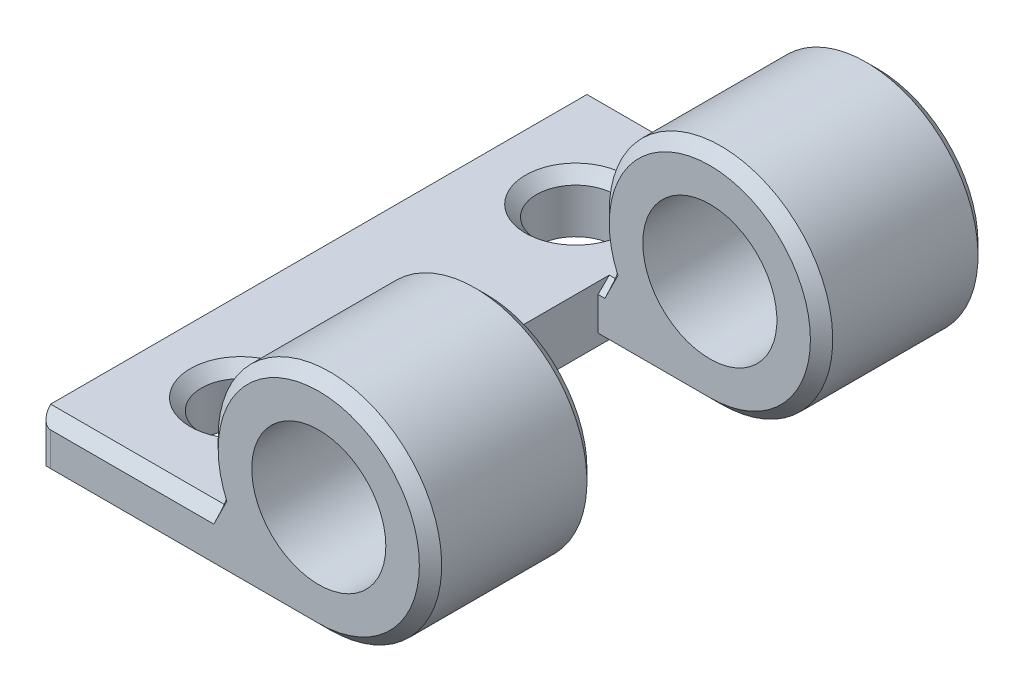
ISO-10303-21;
HEADER;
FILE_DESCRIPTION(('STEP AP214'),'2;1');
FILE_NAME('part.step','',(''),(''),'','','');
FILE_SCHEMA(('AUTOMOTIVE_DESIGN { 1 0 10303 214 1 1 1 1 }'));
ENDSEC;
DATA;
#1=APPLICATION_CONTEXT('core data for automotive mechanical design processes');
#2=APPLICATION_PROTOCOL_DEFINITION('international standard','automotive_design',2000,#1);
#3=PRODUCT_CONTEXT('',#1,'mechanical');
#4=PRODUCT('Part','Part','',(#3));
#5=PRODUCT_RELATED_PRODUCT_CATEGORY('part','',(#4));
#6=PRODUCT_DEFINITION_FORMATION('','',#4);
#7=PRODUCT_DEFINITION_CONTEXT('part definition',#1,'design');
#8=PRODUCT_DEFINITION('design','',#6,#7);
#9=PRODUCT_DEFINITION_SHAPE('','',#8);
#10=(LENGTH_UNIT() NAMED_UNIT(*) SI_UNIT(.MILLI.,.METRE.));
#11=(NAMED_UNIT(*) PLANE_ANGLE_UNIT() SI_UNIT($,.RADIAN.));
#12=(NAMED_UNIT(*) SI_UNIT($,.STERADIAN.) SOLID_ANGLE_UNIT());
#13=UNCERTAINTY_MEASURE_WITH_UNIT(LENGTH_MEASURE(1.E-05),#10,'distance_accuracy_value','');
#14=(GEOMETRIC_REPRESENTATION_CONTEXT(3) GLOBAL_UNCERTAINTY_ASSIGNED_CONTEXT((#13)) GLOBAL_UNIT_ASSIGNED_CONTEXT((#10,
#11,#12)) REPRESENTATION_CONTEXT('',''));
#15=CARTESIAN_POINT('',(0.,0.,0.));
#16=DIRECTION('',(0.,0.,1.));
#17=DIRECTION('',(1.,0.,0.));
#18=AXIS2_PLACEMENT_3D('',#15,#16,#17);
#19=CARTESIAN_POINT('',(-3.64490300051137,-5.46995691895929,34.3749997192379));
#20=DIRECTION('',(0.,0.,-1.));
#21=DIRECTION('',(-1.,0.,0.));
#22=AXIS2_PLACEMENT_3D('',#19,#20,#21);
#23=CYLINDRICAL_SURFACE('',#22,3.75);
#24=DIRECTION('',(0.,0.,-1.));
#25=VECTOR('',#24,1.);
#26=CARTESIAN_POINT('',(-3.64490300051137,-9.21995691895929,34.3749997192379));
#27=LINE('',#26,#25);
#28=CARTESIAN_POINT('',(-3.64490300051137,-9.21995691895929,33.9999997192379));
#29=VERTEX_POINT('',#28);
#30=CARTESIAN_POINT('',(-3.64490300051137,-9.21995691895929,29.1249997192379));
#31=VERTEX_POINT('',#30);
#32=EDGE_CURVE('E197',#29,#31,#27,.T.);
#33=ORIENTED_EDGE('',*,*,#32,.T.);
#34=CARTESIAN_POINT('',(-3.64490300051137,-5.46995691895929,29.1249997192379));
#35=DIRECTION('',(0.,0.,1.));
#36=DIRECTION('',(1.,0.,0.));
#37=AXIS2_PLACEMENT_3D('',#34,#35,#36);
#38=CIRCLE('',#37,3.75);
#39=CARTESIAN_POINT('',(-7.07232507403787,-6.99156065512165,29.1249997192379));
#40=VERTEX_POINT('',#39);
#41=EDGE_CURVE('E562',#31,#40,#38,.T.);
#42=ORIENTED_EDGE('',*,*,#41,.T.);
#43=DIRECTION('',(0.,0.,-1.));
#44=VECTOR('',#43,1.);
#45=CARTESIAN_POINT('',(-7.07232507403787,-6.99156065512165,34.3749997192379));
#46=LINE('',#45,#44);
#47=CARTESIAN_POINT('',(-7.07232507403787,-6.99156065512165,33.9999997192379));
#48=VERTEX_POINT('',#47);
#49=EDGE_CURVE('E558',#40,#48,#46,.F.);
#50=ORIENTED_EDGE('',*,*,#49,.T.);
#51=CARTESIAN_POINT('',(-3.64490300051137,-5.46995691895929,33.9999997192379));
#52=DIRECTION('',(0.,0.,1.));
#53=DIRECTION('',(1.,0.,0.));
#54=AXIS2_PLACEMENT_3D('',#51,#52,#53);
#55=CIRCLE('',#54,3.75);
#56=EDGE_CURVE('E560',#48,#29,#55,.F.);
#57=ORIENTED_EDGE('',*,*,#56,.T.);
#58=EDGE_LOOP('',(#33,#42,#50,#57));
#59=FACE_BOUND('',#58,.T.);
#60=ADVANCED_FACE('F38',(#59),#23,.T.);
#61=CARTESIAN_POINT('',(-3.64490300051137,-5.46995691895929,34.3749997192379));
#62=DIRECTION('',(0.,0.,-1.));
#63=DIRECTION('',(-1.,0.,0.));
#64=AXIS2_PLACEMENT_3D('',#61,#62,#63);
#65=CYLINDRICAL_SURFACE('',#64,2.25);
#66=CARTESIAN_POINT('',(-3.64490300051137,-5.46995691895929,21.2499997192379));
#67=DIRECTION('',(0.,0.,-1.));
#68=DIRECTION('',(-1.,0.,0.));
#69=AXIS2_PLACEMENT_3D('',#66,#67,#68);
#70=CIRCLE('',#69,2.25);
#71=CARTESIAN_POINT('',(-5.89490300051137,-5.46995691895929,21.2499997192379));
#72=VERTEX_POINT('',#71);
#73=EDGE_CURVE('E598',#72,#72,#70,.T.);
#74=ORIENTED_EDGE('',*,*,#73,.F.);
#75=EDGE_LOOP('',(#74));
#76=FACE_BOUND('',#75,.T.);
#77=CARTESIAN_POINT('',(-3.64490300051137,-5.46995691895929,15.6249997192379));
#78=DIRECTION('',(0.,0.,1.));
#79=DIRECTION('',(1.,0.,0.));
#80=AXIS2_PLACEMENT_3D('',#77,#78,#79);
#81=CIRCLE('',#80,2.25);
#82=CARTESIAN_POINT('',(-1.39490300051137,-5.46995691895929,15.6249997192379));
#83=VERTEX_POINT('',#82);
#84=EDGE_CURVE('E591',#83,#83,#81,.T.);
#85=ORIENTED_EDGE('',*,*,#84,.F.);
#86=EDGE_LOOP('',(#85));
#87=FACE_BOUND('',#86,.T.);
#88=ADVANCED_FACE('F313',(#76,#87),#65,.F.);
#89=CARTESIAN_POINT('',(-3.64490300051137,-5.46995691895929,34.3749997192379));
#90=DIRECTION('',(0.,0.,1.));
#91=DIRECTION('',(1.,0.,0.));
#92=AXIS2_PLACEMENT_3D('',#89,#90,#91);
#93=PLANE('',#92);
#94=DIRECTION('',(-1.,0.,0.));
#95=VECTOR('',#94,1.);
#96=CARTESIAN_POINT('',(-13.0199030005114,-7.7199569189593,34.3749997192379));
#97=LINE('',#96,#95);
#98=CARTESIAN_POINT('',(-7.16701731754134,-7.71995691895929,34.3749997192379));
#99=VERTEX_POINT('',#98);
#100=CARTESIAN_POINT('',(-12.6449030005114,-7.7199569189593,34.3749997192379));
#101=VERTEX_POINT('',#100);
#102=EDGE_CURVE('E257',#99,#101,#97,.T.);
#103=ORIENTED_EDGE('',*,*,#102,.T.);
#104=DIRECTION('',(0.,-1.,0.));
#105=VECTOR('',#104,1.);
#106=CARTESIAN_POINT('',(-12.6449030005114,-8.84495691895929,34.3749997192379));
#107=LINE('',#106,#105);
#108=CARTESIAN_POINT('',(-12.6449030005114,-8.84495691895929,34.3749997192379));
#109=VERTEX_POINT('',#108);
#110=EDGE_CURVE('E231',#101,#109,#107,.T.);
#111=ORIENTED_EDGE('',*,*,#110,.T.);
#112=DIRECTION('',(1.,0.,0.));
#113=VECTOR('',#112,1.);
#114=CARTESIAN_POINT('',(-3.64490300051137,-8.84495691895929,34.3749997192379));
#115=LINE('',#114,#113);
#116=CARTESIAN_POINT('',(-3.64490300051137,-8.84495691895929,34.3749997192379));
#117=VERTEX_POINT('',#116);
#118=EDGE_CURVE('E239',#109,#117,#115,.T.);
#119=ORIENTED_EDGE('',*,*,#118,.T.);
#120=CARTESIAN_POINT('',(-3.64490300051137,-5.46995691895929,34.3749997192379));
#121=DIRECTION('',(0.,0.,1.));
#122=DIRECTION('',(1.,0.,0.));
#123=AXIS2_PLACEMENT_3D('',#120,#121,#122);
#124=CIRCLE('',#123,3.375);
#125=CARTESIAN_POINT('',(-6.72958286668522,-6.83940028150542,34.3749997192379));
#126=VERTEX_POINT('',#125);
#127=EDGE_CURVE('E266',#117,#126,#124,.T.);
#128=ORIENTED_EDGE('',*,*,#127,.T.);
#129=CARTESIAN_POINT('',(-7.16701731754134,-7.71995691895929,34.3749997192379));
#130=CARTESIAN_POINT('',(-7.12769350202573,-7.64079798052974,34.3749997192379));
#131=CARTESIAN_POINT('',(-7.08836968651011,-7.56163904210018,34.3749997192379));
#132=CARTESIAN_POINT('',(-7.00972205547888,-7.40332116524107,34.3749997192379));
#133=CARTESIAN_POINT('',(-6.97039823996327,-7.32416222681152,34.3749997192379));
#134=CARTESIAN_POINT('',(-6.86391057186017,-7.10980228608978,34.3749997192379));
#135=CARTESIAN_POINT('',(-6.79674671927269,-6.9746012837976,34.3749997192379));
#136=CARTESIAN_POINT('',(-6.72958286668522,-6.83940028150542,34.3749997192379));
#137=B_SPLINE_CURVE_WITH_KNOTS('',3,(#129,#130,#131,#132,#133,#134,#135,#136),.UNSPECIFIED.,.F.,
.F.,(4,2,2,4),(0.,0.265165042944959,0.530330085889919,0.983223723554248),.UNSPECIFIED.);
#138=EDGE_CURVE('E259',#126,#99,#137,.F.);
#139=ORIENTED_EDGE('',*,*,#138,.T.);
#140=EDGE_LOOP('',(#103,#111,#119,#128,#139));
#141=FACE_BOUND('',#140,.T.);
#142=CARTESIAN_POINT('',(-3.64490300051137,-5.46995691895929,34.3749997192379));
#143=DIRECTION('',(0.,0.,1.));
#144=DIRECTION('',(1.,0.,0.));
#145=AXIS2_PLACEMENT_3D('',#142,#143,#144);
#146=CIRCLE('',#145,2.25);
#147=CARTESIAN_POINT('',(-1.39490300051137,-5.46995691895929,34.3749997192379));
#148=VERTEX_POINT('',#147);
#149=EDGE_CURVE('E588',#148,#148,#146,.T.);
#150=ORIENTED_EDGE('',*,*,#149,.F.);
#151=EDGE_LOOP('',(#150));
#152=FACE_BOUND('',#151,.T.);
#153=ADVANCED_FACE('F255',(#141,#152),#93,.T.);
#154=CARTESIAN_POINT('',(-3.64490300051137,-5.46995691895929,15.6249997192379));
#155=DIRECTION('',(0.,0.,1.));
#156=DIRECTION('',(1.,0.,0.));
#157=AXIS2_PLACEMENT_3D('',#154,#155,#156);
#158=PLANE('',#157);
#159=DIRECTION('',(-1.,0.,0.));
#160=VECTOR('',#159,1.);
#161=CARTESIAN_POINT('',(-3.64490300051137,-8.84495691895929,15.6249997192379));
#162=LINE('',#161,#160);
#163=CARTESIAN_POINT('',(-3.64490300051137,-8.84495691895929,15.6249997192379));
#164=VERTEX_POINT('',#163);
#165=CARTESIAN_POINT('',(-12.6449030005114,-8.84495691895929,15.6249997192379));
#166=VERTEX_POINT('',#165);
#167=EDGE_CURVE('E566',#164,#166,#162,.T.);
#168=ORIENTED_EDGE('',*,*,#167,.T.);
#169=DIRECTION('',(0.,-1.,0.));
#170=VECTOR('',#169,1.);
#171=CARTESIAN_POINT('',(-12.6449030005114,-5.4699569189593,15.6249997192379));
#172=LINE('',#171,#170);
#173=CARTESIAN_POINT('',(-12.6449030005114,-7.71995691895929,15.6249997192379));
#174=VERTEX_POINT('',#173);
#175=EDGE_CURVE('E227',#166,#174,#172,.F.);
#176=ORIENTED_EDGE('',*,*,#175,.T.);
#177=DIRECTION('',(1.,0.,0.));
#178=VECTOR('',#177,1.);
#179=CARTESIAN_POINT('',(-3.64490300051137,-7.71995691895929,15.6249997192379));
#180=LINE('',#179,#178);
#181=CARTESIAN_POINT('',(-7.16701731754134,-7.71995691895929,15.6249997192379));
#182=VERTEX_POINT('',#181);
#183=EDGE_CURVE('E569',#174,#182,#180,.T.);
#184=ORIENTED_EDGE('',*,*,#183,.T.);
#185=CARTESIAN_POINT('',(-6.72958286668522,-6.83940028150542,15.6249997192379));
#186=CARTESIAN_POINT('',(-6.76890668220083,-6.91855921993497,15.6249997192379));
#187=CARTESIAN_POINT('',(-6.80823049771645,-6.99771815836453,15.6249997192379));
#188=CARTESIAN_POINT('',(-6.88687812874768,-7.15603603522363,15.6249997192379));
#189=CARTESIAN_POINT('',(-6.92620194426329,-7.23519497365319,15.6249997192379));
#190=CARTESIAN_POINT('',(-7.03268961236638,-7.44955491437492,15.6249997192379));
#191=CARTESIAN_POINT('',(-7.09985346495386,-7.58475591666711,15.6249997192379));
#192=CARTESIAN_POINT('',(-7.16701731754134,-7.71995691895929,15.6249997192379));
#193=B_SPLINE_CURVE_WITH_KNOTS('',3,(#185,#186,#187,#188,#189,#190,#191,#192),.UNSPECIFIED.,.F.,
.F.,(4,2,2,4),(0.,0.265165042944955,0.530330085889909,0.98322372355424),.UNSPECIFIED.);
#194=CARTESIAN_POINT('',(-6.72958286668522,-6.83940028150542,15.6249997192379));
#195=VERTEX_POINT('',#194);
#196=EDGE_CURVE('E264',#182,#195,#193,.F.);
#197=ORIENTED_EDGE('',*,*,#196,.T.);
#198=CARTESIAN_POINT('',(-3.64490300051137,-5.46995691895929,15.6249997192379));
#199=DIRECTION('',(0.,0.,1.));
#200=DIRECTION('',(1.,0.,0.));
#201=AXIS2_PLACEMENT_3D('',#198,#199,#200);
#202=CIRCLE('',#201,3.375);
#203=EDGE_CURVE('E564',#195,#164,#202,.F.);
#204=ORIENTED_EDGE('',*,*,#203,.T.);
#205=EDGE_LOOP('',(#168,#176,#184,#197,#204));
#206=FACE_BOUND('',#205,.T.);
#207=ORIENTED_EDGE('',*,*,#84,.T.);
#208=EDGE_LOOP('',(#207));
#209=FACE_BOUND('',#208,.T.);
#210=ADVANCED_FACE('F316',(#206,#209),#158,.F.);
#211=CARTESIAN_POINT('',(-13.0199030005114,-7.34495691895929,34.3749997192379));
#212=DIRECTION('',(1.,0.,0.));
#213=DIRECTION('',(0.,1.,0.));
#214=AXIS2_PLACEMENT_3D('',#211,#212,#213);
#215=PLANE('',#214);
#216=DIRECTION('',(0.,0.,-1.));
#217=VECTOR('',#216,1.);
#218=CARTESIAN_POINT('',(-13.0199030005114,-7.34495691895929,34.3749997192379));
#219=LINE('',#218,#217);
#220=CARTESIAN_POINT('',(-13.0199030005114,-7.34495691895929,33.9999997192379));
#221=VERTEX_POINT('',#220);
#222=CARTESIAN_POINT('',(-13.0199030005114,-7.34495691895929,15.9999997192379));
#223=VERTEX_POINT('',#222);
#224=EDGE_CURVE('E198',#221,#223,#219,.T.);
#225=ORIENTED_EDGE('',*,*,#224,.T.);
#226=DIRECTION('',(0.,-1.,0.));
#227=VECTOR('',#226,1.);
#228=CARTESIAN_POINT('',(-13.0199030005114,-7.34495691895929,15.9999997192379));
#229=LINE('',#228,#227);
#230=CARTESIAN_POINT('',(-13.0199030005114,-9.21995691895929,15.9999997192379));
#231=VERTEX_POINT('',#230);
#232=EDGE_CURVE('E222',#223,#231,#229,.T.);
#233=ORIENTED_EDGE('',*,*,#232,.T.);
#234=DIRECTION('',(0.,0.,-1.));
#235=VECTOR('',#234,1.);
#236=CARTESIAN_POINT('',(-13.0199030005114,-9.21995691895929,34.3749997192379));
#237=LINE('',#236,#235);
#238=CARTESIAN_POINT('',(-13.0199030005114,-9.21995691895929,33.9999997192379));
#239=VERTEX_POINT('',#238);
#240=EDGE_CURVE('E242',#239,#231,#237,.T.);
#241=ORIENTED_EDGE('',*,*,#240,.F.);
#242=DIRECTION('',(0.,-1.,0.));
#243=VECTOR('',#242,1.);
#244=CARTESIAN_POINT('',(-13.0199030005114,-7.7199569189593,33.9999997192379));
#245=LINE('',#244,#243);
#246=EDGE_CURVE('E220',#239,#221,#245,.F.);
#247=ORIENTED_EDGE('',*,*,#246,.T.);
#248=EDGE_LOOP('',(#225,#233,#241,#247));
#249=FACE_BOUND('',#248,.T.);
#250=ADVANCED_FACE('F249',(#249),#215,.F.);
#251=CARTESIAN_POINT('',(-3.64490300051137,-9.21995691895929,34.3749997192379));
#252=DIRECTION('',(0.,1.,0.));
#253=DIRECTION('',(-1.,0.,0.));
#254=AXIS2_PLACEMENT_3D('',#251,#252,#253);
#255=PLANE('',#254);
#256=CARTESIAN_POINT('',(-10.0199030005114,-9.21995691895929,19.3749997192379));
#257=DIRECTION('',(0.,1.,0.));
#258=DIRECTION('',(-1.,0.,0.));
#259=AXIS2_PLACEMENT_3D('',#256,#257,#258);
#260=CIRCLE('',#259,1.3125);
#261=CARTESIAN_POINT('',(-11.3324030005114,-9.21995691895929,19.3749997192379));
#262=VERTEX_POINT('',#261);
#263=EDGE_CURVE('E613',#262,#262,#260,.T.);
#264=ORIENTED_EDGE('',*,*,#263,.T.);
#265=EDGE_LOOP('',(#264));
#266=FACE_BOUND('',#265,.T.);
#267=CARTESIAN_POINT('',(-10.0199030005114,-9.21995691895929,30.6249997192379));
#268=DIRECTION('',(0.,1.,0.));
#269=DIRECTION('',(-1.,0.,0.));
#270=AXIS2_PLACEMENT_3D('',#267,#268,#269);
#271=CIRCLE('',#270,1.3125);
#272=CARTESIAN_POINT('',(-11.3324030005114,-9.21995691895929,30.6249997192379));
#273=VERTEX_POINT('',#272);
#274=EDGE_CURVE('E612',#273,#273,#271,.T.);
#275=ORIENTED_EDGE('',*,*,#274,.T.);
#276=EDGE_LOOP('',(#275));
#277=FACE_BOUND('',#276,.T.);
#278=DIRECTION('',(0.,0.,1.));
#279=VECTOR('',#278,1.);
#280=CARTESIAN_POINT('',(-7.39490300051136,-9.21995691895929,34.3749997192379));
#281=LINE('',#280,#279);
#282=CARTESIAN_POINT('',(-7.39490300051136,-9.21995691895929,20.8749997192379));
#283=VERTEX_POINT('',#282);
#284=CARTESIAN_POINT('',(-7.39490300051136,-9.21995691895929,29.1249997192379));
#285=VERTEX_POINT('',#284);
#286=EDGE_CURVE('E602',#283,#285,#281,.T.);
#287=ORIENTED_EDGE('',*,*,#286,.T.);
#288=DIRECTION('',(1.,0.,0.));
#289=VECTOR('',#288,1.);
#290=CARTESIAN_POINT('',(-3.64490300051137,-9.21995691895929,29.1249997192379));
#291=LINE('',#290,#289);
#292=EDGE_CURVE('E536',#285,#31,#291,.T.);
#293=ORIENTED_EDGE('',*,*,#292,.T.);
#294=ORIENTED_EDGE('',*,*,#32,.F.);
#295=DIRECTION('',(-1.,0.,0.));
#296=VECTOR('',#295,1.);
#297=CARTESIAN_POINT('',(-13.0199030005114,-9.21995691895929,33.9999997192379));
#298=LINE('',#297,#296);
#299=EDGE_CURVE('E207',#29,#239,#298,.T.);
#300=ORIENTED_EDGE('',*,*,#299,.T.);
#301=ORIENTED_EDGE('',*,*,#240,.T.);
#302=DIRECTION('',(1.,0.,0.));
#303=VECTOR('',#302,1.);
#304=CARTESIAN_POINT('',(-3.64490300051137,-9.21995691895929,15.9999997192379));
#305=LINE('',#304,#303);
#306=CARTESIAN_POINT('',(-3.64490300051137,-9.21995691895929,15.9999997192379));
#307=VERTEX_POINT('',#306);
#308=EDGE_CURVE('E196',#231,#307,#305,.T.);
#309=ORIENTED_EDGE('',*,*,#308,.T.);
#310=CARTESIAN_POINT('',(-3.64490300051137,-9.21995691895929,20.8749997192379));
#311=VERTEX_POINT('',#310);
#312=EDGE_CURVE('E178',#311,#307,#27,.T.);
#313=ORIENTED_EDGE('',*,*,#312,.F.);
#314=DIRECTION('',(-1.,0.,0.));
#315=VECTOR('',#314,1.);
#316=CARTESIAN_POINT('',(-3.64490300051137,-9.21995691895929,20.8749997192379));
#317=LINE('',#316,#315);
#318=EDGE_CURVE('E192',#311,#283,#317,.T.);
#319=ORIENTED_EDGE('',*,*,#318,.T.);
#320=EDGE_LOOP('',(#287,#293,#294,#300,#301,#309,#313,#319));
#321=FACE_BOUND('',#320,.T.);
#322=ADVANCED_FACE('F191',(#266,#277,#321),#255,.F.);
#323=ORIENTED_EDGE('',*,*,#312,.T.);
#324=CARTESIAN_POINT('',(-3.64490300051137,-5.46995691895929,15.9999997192379));
#325=DIRECTION('',(0.,0.,1.));
#326=DIRECTION('',(1.,0.,0.));
#327=AXIS2_PLACEMENT_3D('',#324,#325,#326);
#328=CIRCLE('',#327,3.75);
#329=CARTESIAN_POINT('',(-7.07232507403787,-6.99156065512165,15.9999997192379));
#330=VERTEX_POINT('',#329);
#331=EDGE_CURVE('E185',#307,#330,#328,.T.);
#332=ORIENTED_EDGE('',*,*,#331,.T.);
#333=DIRECTION('',(0.,0.,-1.));
#334=VECTOR('',#333,1.);
#335=CARTESIAN_POINT('',(-7.07232507403787,-6.99156065512165,34.3749997192379));
#336=LINE('',#335,#334);
#337=CARTESIAN_POINT('',(-7.07232507403787,-6.99156065512165,20.8749997192379));
#338=VERTEX_POINT('',#337);
#339=EDGE_CURVE('E180',#330,#338,#336,.F.);
#340=ORIENTED_EDGE('',*,*,#339,.T.);
#341=CARTESIAN_POINT('',(-3.64490300051137,-5.46995691895929,20.8749997192379));
#342=DIRECTION('',(0.,0.,-1.));
#343=DIRECTION('',(-1.,0.,0.));
#344=AXIS2_PLACEMENT_3D('',#341,#342,#343);
#345=CIRCLE('',#344,3.75);
#346=EDGE_CURVE('E175',#338,#311,#345,.T.);
#347=ORIENTED_EDGE('',*,*,#346,.T.);
#348=EDGE_LOOP('',(#323,#332,#340,#347));
#349=FACE_BOUND('',#348,.T.);
#350=ADVANCED_FACE('F177',(#349),#23,.T.);
#351=CARTESIAN_POINT('',(-13.0199030005114,-7.34495691895929,34.3749997192379));
#352=DIRECTION('',(0.,-1.,0.));
#353=DIRECTION('',(1.,0.,0.));
#354=AXIS2_PLACEMENT_3D('',#351,#352,#353);
#355=PLANE('',#354);
#356=DIRECTION('',(-1.,0.,0.));
#357=VECTOR('',#356,1.);
#358=CARTESIAN_POINT('',(-13.0199030005114,-7.34495691895929,29.1249997192379));
#359=LINE('',#358,#357);
#360=CARTESIAN_POINT('',(-7.16701731754134,-7.34495691895929,29.1249997192379));
#361=VERTEX_POINT('',#360);
#362=CARTESIAN_POINT('',(-7.39490300051136,-7.34495691895929,29.1249997192379));
#363=VERTEX_POINT('',#362);
#364=EDGE_CURVE('E555',#361,#363,#359,.T.);
#365=ORIENTED_EDGE('',*,*,#364,.T.);
#366=DIRECTION('',(0.,0.,-1.));
#367=VECTOR('',#366,1.);
#368=CARTESIAN_POINT('',(-7.39490300051136,-7.34495691895929,34.3749997192379));
#369=LINE('',#368,#367);
#370=CARTESIAN_POINT('',(-7.39490300051136,-7.34495691895929,20.8749997192379));
#371=VERTEX_POINT('',#370);
#372=EDGE_CURVE('E252',#363,#371,#369,.T.);
#373=ORIENTED_EDGE('',*,*,#372,.T.);
#374=DIRECTION('',(1.,0.,0.));
#375=VECTOR('',#374,1.);
#376=CARTESIAN_POINT('',(-13.0199030005114,-7.34495691895929,20.8749997192379));
#377=LINE('',#376,#375);
#378=CARTESIAN_POINT('',(-7.16701731754134,-7.34495691895929,20.8749997192379));
#379=VERTEX_POINT('',#378);
#380=EDGE_CURVE('E546',#371,#379,#377,.T.);
#381=ORIENTED_EDGE('',*,*,#380,.T.);
#382=DIRECTION('',(0.,0.,-1.));
#383=VECTOR('',#382,1.);
#384=CARTESIAN_POINT('',(-7.16701731754134,-7.34495691895929,15.6249997192379));
#385=LINE('',#384,#383);
#386=CARTESIAN_POINT('',(-7.16701731754134,-7.34495691895929,15.9999997192379));
#387=VERTEX_POINT('',#386);
#388=EDGE_CURVE('E544',#379,#387,#385,.T.);
#389=ORIENTED_EDGE('',*,*,#388,.T.);
#390=DIRECTION('',(-1.,0.,0.));
#391=VECTOR('',#390,1.);
#392=CARTESIAN_POINT('',(-13.0199030005114,-7.34495691895929,15.9999997192379));
#393=LINE('',#392,#391);
#394=EDGE_CURVE('E548',#387,#223,#393,.T.);
#395=ORIENTED_EDGE('',*,*,#394,.T.);
#396=ORIENTED_EDGE('',*,*,#224,.F.);
#397=DIRECTION('',(1.,0.,0.));
#398=VECTOR('',#397,1.);
#399=CARTESIAN_POINT('',(-6.89249826470301,-7.34495691895929,33.9999997192379));
#400=LINE('',#399,#398);
#401=CARTESIAN_POINT('',(-7.16701731754134,-7.34495691895929,33.9999997192379));
#402=VERTEX_POINT('',#401);
#403=EDGE_CURVE('E553',#221,#402,#400,.T.);
#404=ORIENTED_EDGE('',*,*,#403,.T.);
#405=DIRECTION('',(0.,0.,-1.));
#406=VECTOR('',#405,1.);
#407=CARTESIAN_POINT('',(-7.16701731754134,-7.34495691895929,28.7499997192379));
#408=LINE('',#407,#406);
#409=EDGE_CURVE('E551',#402,#361,#408,.T.);
#410=ORIENTED_EDGE('',*,*,#409,.T.);
#411=EDGE_LOOP('',(#365,#373,#381,#389,#395,#396,#404,#410));
#412=FACE_BOUND('',#411,.T.);
#413=CARTESIAN_POINT('',(-10.0199030005114,-7.34495691895929,30.6249997192379));
#414=DIRECTION('',(0.,-1.,0.));
#415=DIRECTION('',(1.,0.,0.));
#416=AXIS2_PLACEMENT_3D('',#413,#414,#415);
#417=CIRCLE('',#416,1.68749999999999);
#418=CARTESIAN_POINT('',(-8.33240300051138,-7.34495691895929,30.6249997192379));
#419=VERTEX_POINT('',#418);
#420=EDGE_CURVE('E529',#419,#419,#417,.T.);
#421=ORIENTED_EDGE('',*,*,#420,.T.);
#422=EDGE_LOOP('',(#421));
#423=FACE_BOUND('',#422,.T.);
#424=CARTESIAN_POINT('',(-10.0199030005114,-7.34495691895929,19.3749997192379));
#425=DIRECTION('',(0.,-1.,0.));
#426=DIRECTION('',(1.,0.,0.));
#427=AXIS2_PLACEMENT_3D('',#424,#425,#426);
#428=CIRCLE('',#427,1.6875);
#429=CARTESIAN_POINT('',(-8.33240300051137,-7.34495691895929,19.3749997192379));
#430=VERTEX_POINT('',#429);
#431=EDGE_CURVE('E526',#430,#430,#428,.T.);
#432=ORIENTED_EDGE('',*,*,#431,.T.);
#433=EDGE_LOOP('',(#432));
#434=FACE_BOUND('',#433,.T.);
#435=ADVANCED_FACE('F311',(#412,#423,#434),#355,.F.);
#436=CARTESIAN_POINT('',(-3.64490300051137,-5.46995691895929,28.7499997192379));
#437=DIRECTION('',(0.,0.,1.));
#438=DIRECTION('',(1.,0.,0.));
#439=AXIS2_PLACEMENT_3D('',#436,#437,#438);
#440=CIRCLE('',#439,2.25);
#441=CARTESIAN_POINT('',(-1.39490300051137,-5.46995691895929,28.7499997192379));
#442=VERTEX_POINT('',#441);
#443=EDGE_CURVE('E595',#442,#442,#440,.T.);
#444=ORIENTED_EDGE('',*,*,#443,.F.);
#445=EDGE_LOOP('',(#444));
#446=FACE_BOUND('',#445,.T.);
#447=ORIENTED_EDGE('',*,*,#149,.T.);
#448=EDGE_LOOP('',(#447));
#449=FACE_BOUND('',#448,.T.);
#450=ADVANCED_FACE('F307',(#446,#449),#65,.F.);
#451=CARTESIAN_POINT('',(-10.0199030005114,-11.0949569189593,30.6249997192379));
#452=DIRECTION('',(0.,1.,0.));
#453=DIRECTION('',(-1.,0.,0.));
#454=AXIS2_PLACEMENT_3D('',#451,#452,#453);
#455=CYLINDRICAL_SURFACE('',#454,1.3125);
#456=CARTESIAN_POINT('',(-10.0199030005114,-7.71995691895928,30.6249997192379));
#457=DIRECTION('',(0.,-1.,0.));
#458=DIRECTION('',(0.,0.,-1.));
#459=AXIS2_PLACEMENT_3D('',#456,#457,#458);
#460=CIRCLE('',#459,1.3125);
#461=CARTESIAN_POINT('',(-10.0199030005114,-7.71995691895928,29.3124997192379));
#462=VERTEX_POINT('',#461);
#463=EDGE_CURVE('E604',#462,#462,#460,.F.);
#464=ORIENTED_EDGE('',*,*,#463,.T.);
#465=EDGE_LOOP('',(#464));
#466=FACE_BOUND('',#465,.T.);
#467=ORIENTED_EDGE('',*,*,#274,.F.);
#468=EDGE_LOOP('',(#467));
#469=FACE_BOUND('',#468,.T.);
#470=ADVANCED_FACE('F303',(#466,#469),#455,.F.);
#471=CARTESIAN_POINT('',(-10.0199030005114,-11.0949569189593,19.3749997192379));
#472=DIRECTION('',(0.,1.,0.));
#473=DIRECTION('',(-1.,0.,0.));
#474=AXIS2_PLACEMENT_3D('',#471,#472,#473);
#475=CYLINDRICAL_SURFACE('',#474,1.3125);
#476=CARTESIAN_POINT('',(-10.0199030005114,-7.71995691895929,19.3749997192379));
#477=DIRECTION('',(0.,-1.,0.));
#478=DIRECTION('',(0.,0.,-1.));
#479=AXIS2_PLACEMENT_3D('',#476,#477,#478);
#480=CIRCLE('',#479,1.3125);
#481=CARTESIAN_POINT('',(-10.0199030005114,-7.71995691895929,18.0624997192379));
#482=VERTEX_POINT('',#481);
#483=EDGE_CURVE('E245',#482,#482,#480,.F.);
#484=ORIENTED_EDGE('',*,*,#483,.T.);
#485=EDGE_LOOP('',(#484));
#486=FACE_BOUND('',#485,.T.);
#487=ORIENTED_EDGE('',*,*,#263,.F.);
#488=EDGE_LOOP('',(#487));
#489=FACE_BOUND('',#488,.T.);
#490=ADVANCED_FACE('F299',(#486,#489),#475,.F.);
#491=CARTESIAN_POINT('',(-7.39490300051136,-14.8449569189593,28.7499997192379));
#492=DIRECTION('',(-1.,0.,0.));
#493=DIRECTION('',(0.,-1.,0.));
#494=AXIS2_PLACEMENT_3D('',#491,#492,#493);
#495=PLANE('',#494);
#496=ORIENTED_EDGE('',*,*,#286,.F.);
#497=DIRECTION('',(0.,-0.70710678118655,-0.707106781186546));
#498=VECTOR('',#497,1.);
#499=CARTESIAN_POINT('',(-7.39490300051136,-8.09495691895931,21.9999997192379));
#500=LINE('',#499,#498);
#501=CARTESIAN_POINT('',(-7.39490300051136,-8.84495691895929,21.2499997192379));
#502=VERTEX_POINT('',#501);
#503=EDGE_CURVE('E206',#283,#502,#500,.F.);
#504=ORIENTED_EDGE('',*,*,#503,.T.);
#505=DIRECTION('',(0.,1.,0.));
#506=VECTOR('',#505,1.);
#507=CARTESIAN_POINT('',(-7.39490300051136,-14.8449569189593,21.2499997192379));
#508=LINE('',#507,#506);
#509=CARTESIAN_POINT('',(-7.39490300051136,-7.71995691895929,21.2499997192379));
#510=VERTEX_POINT('',#509);
#511=EDGE_CURVE('E599',#502,#510,#508,.T.);
#512=ORIENTED_EDGE('',*,*,#511,.T.);
#513=DIRECTION('',(0.,-0.707106781186549,0.707106781186546));
#514=VECTOR('',#513,1.);
#515=CARTESIAN_POINT('',(-7.39490300051136,-15.0324569189593,28.5624997192379));
#516=LINE('',#515,#514);
#517=EDGE_CURVE('E625',#510,#371,#516,.F.);
#518=ORIENTED_EDGE('',*,*,#517,.T.);
#519=ORIENTED_EDGE('',*,*,#372,.F.);
#520=DIRECTION('',(0.,0.707106781186551,0.707106781186544));
#521=VECTOR('',#520,1.);
#522=CARTESIAN_POINT('',(-7.39490300051136,-11.2824569189593,25.1874997192379));
#523=LINE('',#522,#521);
#524=CARTESIAN_POINT('',(-7.39490300051136,-7.71995691895929,28.7499997192379));
#525=VERTEX_POINT('',#524);
#526=EDGE_CURVE('E631',#363,#525,#523,.F.);
#527=ORIENTED_EDGE('',*,*,#526,.T.);
#528=DIRECTION('',(0.,1.,0.));
#529=VECTOR('',#528,1.);
#530=CARTESIAN_POINT('',(-7.39490300051136,-14.8449569189593,28.7499997192379));
#531=LINE('',#530,#529);
#532=CARTESIAN_POINT('',(-7.39490300051136,-8.84495691895929,28.7499997192379));
#533=VERTEX_POINT('',#532);
#534=EDGE_CURVE('E618',#533,#525,#531,.T.);
#535=ORIENTED_EDGE('',*,*,#534,.F.);
#536=DIRECTION('',(0.,0.70710678118655,-0.707106781186545));
#537=VECTOR('',#536,1.);
#538=CARTESIAN_POINT('',(-7.39490300051136,-11.8449569189593,31.7499997192379));
#539=LINE('',#538,#537);
#540=EDGE_CURVE('E326',#533,#285,#539,.F.);
#541=ORIENTED_EDGE('',*,*,#540,.T.);
#542=EDGE_LOOP('',(#496,#504,#512,#518,#519,#527,#535,#541));
#543=FACE_BOUND('',#542,.T.);
#544=ADVANCED_FACE('F296',(#543),#495,.F.);
#545=CARTESIAN_POINT('',(0.105096999488636,-14.8449569189593,21.2499997192379));
#546=DIRECTION('',(0.,0.,-1.));
#547=DIRECTION('',(-1.,0.,0.));
#548=AXIS2_PLACEMENT_3D('',#545,#546,#547);
#549=PLANE('',#548);
#550=ORIENTED_EDGE('',*,*,#73,.T.);
#551=EDGE_LOOP('',(#550));
#552=FACE_BOUND('',#551,.T.);
#553=CARTESIAN_POINT('',(-3.64490300051137,-5.46995691895929,21.2499997192379));
#554=DIRECTION('',(0.,0.,-1.));
#555=DIRECTION('',(-1.,0.,0.));
#556=AXIS2_PLACEMENT_3D('',#553,#554,#555);
#557=CIRCLE('',#556,3.375);
#558=CARTESIAN_POINT('',(-3.64490300051137,-8.84495691895929,21.2499997192379));
#559=VERTEX_POINT('',#558);
#560=CARTESIAN_POINT('',(-6.72958286668522,-6.83940028150542,21.2499997192379));
#561=VERTEX_POINT('',#560);
#562=EDGE_CURVE('E210',#559,#561,#557,.F.);
#563=ORIENTED_EDGE('',*,*,#562,.T.);
#564=CARTESIAN_POINT('',(-7.16701731754134,-7.71995691895929,21.2499997192379));
#565=CARTESIAN_POINT('',(-7.12769350202573,-7.64079798052974,21.2499997192379));
#566=CARTESIAN_POINT('',(-7.08836968651011,-7.56163904210018,21.2499997192379));
#567=CARTESIAN_POINT('',(-7.00972205547889,-7.40332116524107,21.2499997192379));
#568=CARTESIAN_POINT('',(-6.97039823996327,-7.32416222681152,21.2499997192379));
#569=CARTESIAN_POINT('',(-6.86391057186018,-7.10980228608978,21.2499997192379));
#570=CARTESIAN_POINT('',(-6.7967467192727,-6.9746012837976,21.2499997192379));
#571=CARTESIAN_POINT('',(-6.72958286668522,-6.83940028150542,21.2499997192379));
#572=B_SPLINE_CURVE_WITH_KNOTS('',3,(#564,#565,#566,#567,#568,#569,#570,#571),.UNSPECIFIED.,.F.,
.F.,(4,2,2,4),(0.,0.265165042944956,0.530330085889912,0.983223723554243),.UNSPECIFIED.);
#573=CARTESIAN_POINT('',(-7.16701731754134,-7.71995691895929,21.2499997192379));
#574=VERTEX_POINT('',#573);
#575=EDGE_CURVE('E327',#561,#574,#572,.F.);
#576=ORIENTED_EDGE('',*,*,#575,.T.);
#577=DIRECTION('',(-1.,0.,0.));
#578=VECTOR('',#577,1.);
#579=CARTESIAN_POINT('',(0.105096999488634,-7.71995691895929,21.2499997192379));
#580=LINE('',#579,#578);
#581=EDGE_CURVE('E576',#574,#510,#580,.T.);
#582=ORIENTED_EDGE('',*,*,#581,.T.);
#583=ORIENTED_EDGE('',*,*,#511,.F.);
#584=DIRECTION('',(1.,0.,0.));
#585=VECTOR('',#584,1.);
#586=CARTESIAN_POINT('',(0.105096999488635,-8.84495691895929,21.2499997192379));
#587=LINE('',#586,#585);
#588=EDGE_CURVE('E574',#502,#559,#587,.T.);
#589=ORIENTED_EDGE('',*,*,#588,.T.);
#590=EDGE_LOOP('',(#563,#576,#582,#583,#589));
#591=FACE_BOUND('',#590,.T.);
#592=ADVANCED_FACE('F293',(#552,#591),#549,.F.);
#593=CARTESIAN_POINT('',(0.105096999488635,-14.8449569189593,28.7499997192379));
#594=DIRECTION('',(0.,0.,1.));
#595=DIRECTION('',(1.,0.,0.));
#596=AXIS2_PLACEMENT_3D('',#593,#594,#595);
#597=PLANE('',#596);
#598=DIRECTION('',(1.,0.,0.));
#599=VECTOR('',#598,1.);
#600=CARTESIAN_POINT('',(0.105096999488632,-7.71995691895929,28.7499997192379));
#601=LINE('',#600,#599);
#602=CARTESIAN_POINT('',(-7.16701731754134,-7.71995691895929,28.7499997192379));
#603=VERTEX_POINT('',#602);
#604=EDGE_CURVE('E542',#525,#603,#601,.T.);
#605=ORIENTED_EDGE('',*,*,#604,.T.);
#606=CARTESIAN_POINT('',(-6.72958286668522,-6.83940028150542,28.7499997192379));
#607=CARTESIAN_POINT('',(-6.76890668220084,-6.91855921993497,28.7499997192379));
#608=CARTESIAN_POINT('',(-6.80823049771645,-6.99771815836453,28.7499997192379));
#609=CARTESIAN_POINT('',(-6.88687812874768,-7.15603603522363,28.7499997192379));
#610=CARTESIAN_POINT('',(-6.92620194426329,-7.23519497365319,28.7499997192379));
#611=CARTESIAN_POINT('',(-7.03268961236638,-7.44955491437493,28.7499997192379));
#612=CARTESIAN_POINT('',(-7.09985346495386,-7.58475591666711,28.7499997192379));
#613=CARTESIAN_POINT('',(-7.16701731754134,-7.71995691895929,28.7499997192379));
#614=B_SPLINE_CURVE_WITH_KNOTS('',3,(#606,#607,#608,#609,#610,#611,#612,#613),.UNSPECIFIED.,.F.,
.F.,(4,2,2,4),(0.,0.265165042944955,0.530330085889909,0.983223723554241),.UNSPECIFIED.);
#615=CARTESIAN_POINT('',(-6.72958286668522,-6.83940028150542,28.7499997192379));
#616=VERTEX_POINT('',#615);
#617=EDGE_CURVE('E262',#603,#616,#614,.F.);
#618=ORIENTED_EDGE('',*,*,#617,.T.);
#619=CARTESIAN_POINT('',(-3.64490300051137,-5.46995691895929,28.7499997192379));
#620=DIRECTION('',(0.,0.,1.));
#621=DIRECTION('',(1.,0.,0.));
#622=AXIS2_PLACEMENT_3D('',#619,#620,#621);
#623=CIRCLE('',#622,3.375);
#624=CARTESIAN_POINT('',(-3.64490300051137,-8.84495691895929,28.7499997192379));
#625=VERTEX_POINT('',#624);
#626=EDGE_CURVE('E538',#616,#625,#623,.F.);
#627=ORIENTED_EDGE('',*,*,#626,.T.);
#628=DIRECTION('',(-1.,0.,0.));
#629=VECTOR('',#628,1.);
#630=CARTESIAN_POINT('',(0.105096999488634,-8.84495691895929,28.7499997192379));
#631=LINE('',#630,#629);
#632=EDGE_CURVE('E540',#625,#533,#631,.T.);
#633=ORIENTED_EDGE('',*,*,#632,.T.);
#634=ORIENTED_EDGE('',*,*,#534,.T.);
#635=EDGE_LOOP('',(#605,#618,#627,#633,#634));
#636=FACE_BOUND('',#635,.T.);
#637=ORIENTED_EDGE('',*,*,#443,.T.);
#638=EDGE_LOOP('',(#637));
#639=FACE_BOUND('',#638,.T.);
#640=ADVANCED_FACE('F287',(#636,#639),#597,.F.);
#641=CARTESIAN_POINT('',(-10.0199030005114,-7.71995691895928,30.6249997192379));
#642=DIRECTION('',(0.,1.,0.));
#643=DIRECTION('',(0.,0.,1.));
#644=AXIS2_PLACEMENT_3D('',#641,#642,#643);
#645=CONICAL_SURFACE('',#644,1.3125,0.785398163397445);
#646=ORIENTED_EDGE('',*,*,#420,.F.);
#647=EDGE_LOOP('',(#646));
#648=FACE_BOUND('',#647,.T.);
#649=ORIENTED_EDGE('',*,*,#463,.F.);
#650=EDGE_LOOP('',(#649));
#651=FACE_BOUND('',#650,.T.);
#652=ADVANCED_FACE('F292',(#648,#651),#645,.F.);
#653=CARTESIAN_POINT('',(-10.0199030005114,-7.71995691895929,19.3749997192379));
#654=DIRECTION('',(0.,1.,0.));
#655=DIRECTION('',(0.,0.,1.));
#656=AXIS2_PLACEMENT_3D('',#653,#654,#655);
#657=CONICAL_SURFACE('',#656,1.3125,0.785398163397449);
#658=ORIENTED_EDGE('',*,*,#431,.F.);
#659=EDGE_LOOP('',(#658));
#660=FACE_BOUND('',#659,.T.);
#661=ORIENTED_EDGE('',*,*,#483,.F.);
#662=EDGE_LOOP('',(#661));
#663=FACE_BOUND('',#662,.T.);
#664=ADVANCED_FACE('F419',(#660,#663),#657,.F.);
#665=CARTESIAN_POINT('',(-3.64490300051137,-8.84495691895929,34.3749997192379));
#666=DIRECTION('',(0.,-0.707106781186549,0.707106781186546));
#667=DIRECTION('',(-1.,0.,0.));
#668=AXIS2_PLACEMENT_3D('',#665,#666,#667);
#669=PLANE('',#668);
#670=ORIENTED_EDGE('',*,*,#118,.F.);
#671=CARTESIAN_POINT('',(-12.6449030005114,-9.21995691895929,33.9999997192379));
#672=DIRECTION('',(0.,-0.707106781186549,0.707106781186546));
#673=DIRECTION('',(0.,0.707106781186546,0.707106781186549));
#674=AXIS2_PLACEMENT_3D('',#671,#672,#673);
#675=ELLIPSE('',#674,0.53033008588991,0.375);
#676=EDGE_CURVE('E46',#109,#239,#675,.T.);
#677=ORIENTED_EDGE('',*,*,#676,.T.);
#678=ORIENTED_EDGE('',*,*,#299,.F.);
#679=DIRECTION('',(0.,-0.707106781186546,-0.707106781186549));
#680=VECTOR('',#679,1.);
#681=CARTESIAN_POINT('',(-3.64490300051137,-8.84495691895929,34.3749997192379));
#682=LINE('',#681,#680);
#683=EDGE_CURVE('E583',#117,#29,#682,.T.);
#684=ORIENTED_EDGE('',*,*,#683,.F.);
#685=EDGE_LOOP('',(#670,#677,#678,#684));
#686=FACE_BOUND('',#685,.T.);
#687=ADVANCED_FACE('F236',(#686),#669,.T.);
#688=CARTESIAN_POINT('',(-3.64490300051137,-5.46995691895929,34.3749997192379));
#689=DIRECTION('',(0.,0.,-1.));
#690=DIRECTION('',(-1.,0.,0.));
#691=AXIS2_PLACEMENT_3D('',#688,#689,#690);
#692=CONICAL_SURFACE('',#691,3.375,0.785398163397447);
#693=ORIENTED_EDGE('',*,*,#683,.T.);
#694=ORIENTED_EDGE('',*,*,#56,.F.);
#695=DIRECTION('',(-0.646280904047745,-0.286916352031785,-0.707106781186549));
#696=VECTOR('',#695,1.);
#697=CARTESIAN_POINT('',(-6.72958286668522,-6.83940028150542,34.3749997192379));
#698=LINE('',#697,#696);
#699=EDGE_CURVE('E581',#126,#48,#698,.T.);
#700=ORIENTED_EDGE('',*,*,#699,.F.);
#701=ORIENTED_EDGE('',*,*,#127,.F.);
#702=EDGE_LOOP('',(#693,#694,#700,#701));
#703=FACE_BOUND('',#702,.T.);
#704=ADVANCED_FACE('F413',(#703),#692,.T.);
#705=CARTESIAN_POINT('',(-3.64490300051137,-7.71995691895929,34.3749997192379));
#706=DIRECTION('',(0.,0.707106781186549,0.707106781186546));
#707=DIRECTION('',(1.,0.,0.));
#708=AXIS2_PLACEMENT_3D('',#705,#706,#707);
#709=PLANE('',#708);
#710=ORIENTED_EDGE('',*,*,#403,.F.);
#711=CARTESIAN_POINT('',(-12.6449030005114,-7.3449569189593,33.9999997192379));
#712=DIRECTION('',(0.,0.707106781186549,0.707106781186546));
#713=DIRECTION('',(0.,0.707106781186546,-0.707106781186549));
#714=AXIS2_PLACEMENT_3D('',#711,#712,#713);
#715=ELLIPSE('',#714,0.53033008588991,0.375);
#716=EDGE_CURVE('E11',#221,#101,#715,.T.);
#717=ORIENTED_EDGE('',*,*,#716,.T.);
#718=ORIENTED_EDGE('',*,*,#102,.F.);
#719=DIRECTION('',(0.,-0.707106781186546,0.707106781186549));
#720=VECTOR('',#719,1.);
#721=CARTESIAN_POINT('',(-7.16701731754134,-7.34495691895929,33.9999997192379));
#722=LINE('',#721,#720);
#723=EDGE_CURVE('E386',#402,#99,#722,.T.);
#724=ORIENTED_EDGE('',*,*,#723,.F.);
#725=EDGE_LOOP('',(#710,#717,#718,#724));
#726=FACE_BOUND('',#725,.T.);
#727=ADVANCED_FACE('F404',(#726),#709,.T.);
#728=CARTESIAN_POINT('',(-7.16701731754134,-7.34495691895929,33.9999997192379));
#729=CARTESIAN_POINT('',(-7.07232507403787,-6.99156065512165,33.9999997192379));
#730=CARTESIAN_POINT('',(-7.16701731754134,-7.71995691895929,34.3749997192379));
#731=CARTESIAN_POINT('',(-6.72958286668522,-6.83940028150542,34.3749997192379));
#732=B_SPLINE_SURFACE_WITH_KNOTS('',1,1,((#728,#729),(#730,#731)),.UNSPECIFIED.,.F.,.F.,.F.,(2,
2),(2,2),(0.,1.),(0.,1.),.UNSPECIFIED.);
#733=CARTESIAN_POINT('',(-7.07232507403787,-6.99156065512165,33.9999997192379));
#734=CARTESIAN_POINT('',(-7.08376336790614,-7.03424894898992,33.9999997192379));
#735=CARTESIAN_POINT('',(-7.0952016617744,-7.07693724285818,33.9999997192379));
#736=CARTESIAN_POINT('',(-7.11670284929244,-7.15718076709859,33.9999997192379));
#737=CARTESIAN_POINT('',(-7.12676574294222,-7.19473599747073,33.9999997192379));
#738=CARTESIAN_POINT('',(-7.14689153024178,-7.26984645821501,33.9999997192379));
#739=CARTESIAN_POINT('',(-7.15695442389156,-7.30740168858715,33.9999997192379));
#740=CARTESIAN_POINT('',(-7.16701731754134,-7.34495691895929,33.9999997192379));
#741=B_SPLINE_CURVE_WITH_KNOTS('',3,(#733,#734,#735,#736,#737,#738,#739,#740),.UNSPECIFIED.,.F.,
.F.,(4,2,2,4),(0.,0.13258252147248,0.24922262783475,0.365862734197021),.UNSPECIFIED.);
#742=EDGE_CURVE('E376',#402,#48,#741,.F.);
#743=ORIENTED_EDGE('',*,*,#138,.F.);
#744=ORIENTED_EDGE('',*,*,#699,.T.);
#745=ORIENTED_EDGE('',*,*,#742,.F.);
#746=ORIENTED_EDGE('',*,*,#723,.T.);
#747=EDGE_LOOP('',(#743,#744,#745,#746));
#748=FACE_BOUND('',#747,.T.);
#749=ADVANCED_FACE('F394',(#748),#732,.T.);
#750=CARTESIAN_POINT('',(-7.16701731754134,-7.34495691895929,34.3749997192379));
#751=DIRECTION('',(0.965925826289068,-0.258819045102522,0.));
#752=DIRECTION('',(0.,0.,-1.));
#753=AXIS2_PLACEMENT_3D('',#750,#751,#752);
#754=PLANE('',#753);
#755=ORIENTED_EDGE('',*,*,#742,.T.);
#756=ORIENTED_EDGE('',*,*,#49,.F.);
#757=CARTESIAN_POINT('',(-7.16701731754134,-7.34495691895929,29.1249997192379));
#758=CARTESIAN_POINT('',(-7.15293631400302,-7.29240589833273,29.1249997192379));
#759=CARTESIAN_POINT('',(-7.1388553104647,-7.23985487770616,29.1249997192379));
#760=CARTESIAN_POINT('',(-7.11773380515722,-7.16102834676632,29.1249997192379));
#761=CARTESIAN_POINT('',(-7.11069330338807,-7.13475283645304,29.1249997192379));
#762=CARTESIAN_POINT('',(-7.09321022575856,-7.06950510246705,29.1249997192379));
#763=CARTESIAN_POINT('',(-7.08276764989822,-7.03053287879435,29.1249997192379));
#764=CARTESIAN_POINT('',(-7.07232507403787,-6.99156065512165,29.1249997192379));
#765=B_SPLINE_CURVE_WITH_KNOTS('',3,(#757,#758,#759,#760,#761,#762,#763,#764),.UNSPECIFIED.,.F.,
.F.,(4,2,2,4),(0.,0.16321445973276,0.24482168959914,0.365862734197021),.UNSPECIFIED.);
#766=EDGE_CURVE('E368',#361,#40,#765,.T.);
#767=ORIENTED_EDGE('',*,*,#766,.F.);
#768=ORIENTED_EDGE('',*,*,#409,.F.);
#769=EDGE_LOOP('',(#755,#756,#767,#768));
#770=FACE_BOUND('',#769,.T.);
#771=ADVANCED_FACE('F359',(#770),#754,.F.);
#772=CARTESIAN_POINT('',(-13.0199030005114,-7.34495691895929,29.1249997192379));
#773=DIRECTION('',(0.,-0.707106781186544,0.707106781186551));
#774=DIRECTION('',(-1.,0.,0.));
#775=AXIS2_PLACEMENT_3D('',#772,#773,#774);
#776=PLANE('',#775);
#777=ORIENTED_EDGE('',*,*,#526,.F.);
#778=ORIENTED_EDGE('',*,*,#364,.F.);
#779=DIRECTION('',(0.,0.707106781186551,0.707106781186544));
#780=VECTOR('',#779,1.);
#781=CARTESIAN_POINT('',(-7.16701731754134,-7.71995691895929,28.7499997192379));
#782=LINE('',#781,#780);
#783=EDGE_CURVE('E377',#603,#361,#782,.T.);
#784=ORIENTED_EDGE('',*,*,#783,.F.);
#785=ORIENTED_EDGE('',*,*,#604,.F.);
#786=EDGE_LOOP('',(#777,#778,#784,#785));
#787=FACE_BOUND('',#786,.T.);
#788=ADVANCED_FACE('F393',(#787),#776,.F.);
#789=CARTESIAN_POINT('',(-7.07232507403787,-6.99156065512165,29.1249997192379));
#790=CARTESIAN_POINT('',(-7.16701731754134,-7.34495691895929,29.1249997192379));
#791=CARTESIAN_POINT('',(-6.72958286668522,-6.83940028150542,28.7499997192379));
#792=CARTESIAN_POINT('',(-7.16701731754134,-7.71995691895929,28.7499997192379));
#793=B_SPLINE_SURFACE_WITH_KNOTS('',1,1,((#789,#790),(#791,#792)),.UNSPECIFIED.,.F.,.F.,.F.,(2,
2),(2,2),(0.,1.),(0.,1.),.UNSPECIFIED.);
#794=DIRECTION('',(0.646280904047748,0.286916352031786,-0.707106781186546));
#795=VECTOR('',#794,1.);
#796=CARTESIAN_POINT('',(-7.07232507403787,-6.99156065512165,29.1249997192379));
#797=LINE('',#796,#795);
#798=EDGE_CURVE('E214',#616,#40,#797,.F.);
#799=ORIENTED_EDGE('',*,*,#783,.T.);
#800=ORIENTED_EDGE('',*,*,#766,.T.);
#801=ORIENTED_EDGE('',*,*,#798,.F.);
#802=ORIENTED_EDGE('',*,*,#617,.F.);
#803=EDGE_LOOP('',(#799,#800,#801,#802));
#804=FACE_BOUND('',#803,.T.);
#805=ADVANCED_FACE('F353',(#804),#793,.T.);
#806=CARTESIAN_POINT('',(-3.64490300051137,-5.46995691895929,29.1249997192379));
#807=DIRECTION('',(0.,0.,1.));
#808=DIRECTION('',(1.,0.,0.));
#809=AXIS2_PLACEMENT_3D('',#806,#807,#808);
#810=CONICAL_SURFACE('',#809,3.75,0.785398163397452);
#811=ORIENTED_EDGE('',*,*,#798,.T.);
#812=ORIENTED_EDGE('',*,*,#41,.F.);
#813=DIRECTION('',(0.,-0.70710678118655,0.707106781186545));
#814=VECTOR('',#813,1.);
#815=CARTESIAN_POINT('',(-3.64490300051137,-8.84495691895929,28.7499997192379));
#816=LINE('',#815,#814);
#817=EDGE_CURVE('E211',#625,#31,#816,.T.);
#818=ORIENTED_EDGE('',*,*,#817,.F.);
#819=ORIENTED_EDGE('',*,*,#626,.F.);
#820=EDGE_LOOP('',(#811,#812,#818,#819));
#821=FACE_BOUND('',#820,.T.);
#822=ADVANCED_FACE('F349',(#821),#810,.T.);
#823=CARTESIAN_POINT('',(-3.64490300051137,-9.21995691895929,29.1249997192379));
#824=DIRECTION('',(0.,0.707106781186545,0.70710678118655));
#825=DIRECTION('',(1.,0.,0.));
#826=AXIS2_PLACEMENT_3D('',#823,#824,#825);
#827=PLANE('',#826);
#828=ORIENTED_EDGE('',*,*,#540,.F.);
#829=ORIENTED_EDGE('',*,*,#632,.F.);
#830=ORIENTED_EDGE('',*,*,#817,.T.);
#831=ORIENTED_EDGE('',*,*,#292,.F.);
#832=EDGE_LOOP('',(#828,#829,#830,#831));
#833=FACE_BOUND('',#832,.T.);
#834=ADVANCED_FACE('F341',(#833),#827,.F.);
#835=CARTESIAN_POINT('',(-3.64490300051137,-9.21995691895929,20.8749997192379));
#836=DIRECTION('',(0.,0.707106781186545,-0.707106781186549));
#837=DIRECTION('',(-1.,0.,0.));
#838=AXIS2_PLACEMENT_3D('',#835,#836,#837);
#839=PLANE('',#838);
#840=ORIENTED_EDGE('',*,*,#503,.F.);
#841=ORIENTED_EDGE('',*,*,#318,.F.);
#842=DIRECTION('',(0.,-0.70710678118655,-0.707106781186545));
#843=VECTOR('',#842,1.);
#844=CARTESIAN_POINT('',(-3.64490300051137,-8.84495691895929,21.2499997192379));
#845=LINE('',#844,#843);
#846=EDGE_CURVE('E204',#559,#311,#845,.T.);
#847=ORIENTED_EDGE('',*,*,#846,.F.);
#848=ORIENTED_EDGE('',*,*,#588,.F.);
#849=EDGE_LOOP('',(#840,#841,#847,#848));
#850=FACE_BOUND('',#849,.T.);
#851=ADVANCED_FACE('F202',(#850),#839,.F.);
#852=CARTESIAN_POINT('',(-3.64490300051137,-5.46995691895929,20.8749997192379));
#853=DIRECTION('',(0.,0.,-1.));
#854=DIRECTION('',(-1.,0.,0.));
#855=AXIS2_PLACEMENT_3D('',#852,#853,#854);
#856=CONICAL_SURFACE('',#855,3.75,0.785398163397452);
#857=ORIENTED_EDGE('',*,*,#846,.T.);
#858=ORIENTED_EDGE('',*,*,#346,.F.);
#859=DIRECTION('',(-0.646280904047749,-0.286916352031786,-0.707106781186545));
#860=VECTOR('',#859,1.);
#861=CARTESIAN_POINT('',(-6.72958286668522,-6.83940028150542,21.2499997192379));
#862=LINE('',#861,#860);
#863=EDGE_CURVE('E212',#561,#338,#862,.T.);
#864=ORIENTED_EDGE('',*,*,#863,.F.);
#865=ORIENTED_EDGE('',*,*,#562,.F.);
#866=EDGE_LOOP('',(#857,#858,#864,#865));
#867=FACE_BOUND('',#866,.T.);
#868=ADVANCED_FACE('F209',(#867),#856,.T.);
#869=CARTESIAN_POINT('',(-13.0199030005114,-7.34495691895929,20.8749997192379));
#870=DIRECTION('',(0.,-0.707106781186546,-0.707106781186549));
#871=DIRECTION('',(1.,0.,0.));
#872=AXIS2_PLACEMENT_3D('',#869,#870,#871);
#873=PLANE('',#872);
#874=ORIENTED_EDGE('',*,*,#517,.F.);
#875=ORIENTED_EDGE('',*,*,#581,.F.);
#876=DIRECTION('',(0.,-0.707106781186549,0.707106781186546));
#877=VECTOR('',#876,1.);
#878=CARTESIAN_POINT('',(-7.16701731754134,-7.34495691895929,20.8749997192379));
#879=LINE('',#878,#877);
#880=EDGE_CURVE('E216',#379,#574,#879,.T.);
#881=ORIENTED_EDGE('',*,*,#880,.F.);
#882=ORIENTED_EDGE('',*,*,#380,.F.);
#883=EDGE_LOOP('',(#874,#875,#881,#882));
#884=FACE_BOUND('',#883,.T.);
#885=ADVANCED_FACE('F476',(#884),#873,.F.);
#886=CARTESIAN_POINT('',(-7.16701731754134,-7.34495691895929,20.8749997192379));
#887=CARTESIAN_POINT('',(-7.07232507403787,-6.99156065512165,20.8749997192379));
#888=CARTESIAN_POINT('',(-7.16701731754134,-7.71995691895929,21.2499997192379));
#889=CARTESIAN_POINT('',(-6.72958286668522,-6.83940028150542,21.2499997192379));
#890=B_SPLINE_SURFACE_WITH_KNOTS('',1,1,((#886,#887),(#888,#889)),.UNSPECIFIED.,.F.,.F.,.F.,(2,
2),(2,2),(0.,1.),(0.,1.),.UNSPECIFIED.);
#891=CARTESIAN_POINT('',(-7.07232507403787,-6.99156065512165,20.8749997192379));
#892=CARTESIAN_POINT('',(-7.08376336790614,-7.03424894898992,20.8749997192379));
#893=CARTESIAN_POINT('',(-7.0952016617744,-7.07693724285818,20.8749997192379));
#894=CARTESIAN_POINT('',(-7.11670284929244,-7.15718076709859,20.8749997192379));
#895=CARTESIAN_POINT('',(-7.12676574294222,-7.19473599747073,20.8749997192379));
#896=CARTESIAN_POINT('',(-7.14689153024178,-7.26984645821501,20.8749997192379));
#897=CARTESIAN_POINT('',(-7.15695442389156,-7.30740168858715,20.8749997192379));
#898=CARTESIAN_POINT('',(-7.16701731754134,-7.34495691895929,20.8749997192379));
#899=B_SPLINE_CURVE_WITH_KNOTS('',3,(#891,#892,#893,#894,#895,#896,#897,#898),.UNSPECIFIED.,.F.,
.F.,(4,2,2,4),(0.,0.132582521472478,0.24922262783475,0.365862734197021),.UNSPECIFIED.);
#900=EDGE_CURVE('E451',#379,#338,#899,.F.);
#901=ORIENTED_EDGE('',*,*,#575,.F.);
#902=ORIENTED_EDGE('',*,*,#863,.T.);
#903=ORIENTED_EDGE('',*,*,#900,.F.);
#904=ORIENTED_EDGE('',*,*,#880,.T.);
#905=EDGE_LOOP('',(#901,#902,#903,#904));
#906=FACE_BOUND('',#905,.T.);
#907=ADVANCED_FACE('F466',(#906),#890,.T.);
#908=CARTESIAN_POINT('',(-7.16701731754134,-7.34495691895929,34.3749997192379));
#909=DIRECTION('',(0.965925826289068,-0.258819045102522,0.));
#910=DIRECTION('',(0.,0.,-1.));
#911=AXIS2_PLACEMENT_3D('',#908,#909,#910);
#912=PLANE('',#911);
#913=ORIENTED_EDGE('',*,*,#900,.T.);
#914=ORIENTED_EDGE('',*,*,#339,.F.);
#915=CARTESIAN_POINT('',(-7.16701731754134,-7.34495691895929,15.9999997192379));
#916=CARTESIAN_POINT('',(-7.15293631400302,-7.29240589833273,15.9999997192379));
#917=CARTESIAN_POINT('',(-7.1388553104647,-7.23985487770616,15.9999997192379));
#918=CARTESIAN_POINT('',(-7.11773380515722,-7.16102834676632,15.9999997192379));
#919=CARTESIAN_POINT('',(-7.11069330338807,-7.13475283645304,15.9999997192379));
#920=CARTESIAN_POINT('',(-7.09321022575856,-7.06950510246705,15.9999997192379));
#921=CARTESIAN_POINT('',(-7.08276764989822,-7.03053287879435,15.9999997192379));
#922=CARTESIAN_POINT('',(-7.07232507403787,-6.99156065512165,15.9999997192379));
#923=B_SPLINE_CURVE_WITH_KNOTS('',3,(#915,#916,#917,#918,#919,#920,#921,#922),.UNSPECIFIED.,.F.,
.F.,(4,2,2,4),(0.,0.16321445973276,0.24482168959914,0.365862734197021),.UNSPECIFIED.);
#924=EDGE_CURVE('E443',#387,#330,#923,.T.);
#925=ORIENTED_EDGE('',*,*,#924,.F.);
#926=ORIENTED_EDGE('',*,*,#388,.F.);
#927=EDGE_LOOP('',(#913,#914,#925,#926));
#928=FACE_BOUND('',#927,.T.);
#929=ADVANCED_FACE('F434',(#928),#912,.F.);
#930=CARTESIAN_POINT('',(-13.0199030005114,-7.34495691895929,15.9999997192379));
#931=DIRECTION('',(0.,-0.707106781186545,0.70710678118655));
#932=DIRECTION('',(-1.,0.,0.));
#933=AXIS2_PLACEMENT_3D('',#930,#931,#932);
#934=PLANE('',#933);
#935=ORIENTED_EDGE('',*,*,#183,.F.);
#936=CARTESIAN_POINT('',(-12.6449030005114,-7.34495691895929,15.9999997192379));
#937=DIRECTION('',(0.,-0.707106781186545,0.70710678118655));
#938=DIRECTION('',(0.,-0.70710678118655,-0.707106781186545));
#939=AXIS2_PLACEMENT_3D('',#936,#937,#938);
#940=ELLIPSE('',#939,0.530330085889912,0.375);
#941=EDGE_CURVE('E229',#174,#223,#940,.F.);
#942=ORIENTED_EDGE('',*,*,#941,.T.);
#943=ORIENTED_EDGE('',*,*,#394,.F.);
#944=DIRECTION('',(0.,0.70710678118655,0.707106781186545));
#945=VECTOR('',#944,1.);
#946=CARTESIAN_POINT('',(-7.16701731754134,-7.71995691895929,15.6249997192379));
#947=LINE('',#946,#945);
#948=EDGE_CURVE('E452',#182,#387,#947,.T.);
#949=ORIENTED_EDGE('',*,*,#948,.F.);
#950=EDGE_LOOP('',(#935,#942,#943,#949));
#951=FACE_BOUND('',#950,.T.);
#952=ADVANCED_FACE('F465',(#951),#934,.F.);
#953=CARTESIAN_POINT('',(-7.07232507403787,-6.99156065512165,15.9999997192379));
#954=CARTESIAN_POINT('',(-7.16701731754134,-7.34495691895929,15.9999997192379));
#955=CARTESIAN_POINT('',(-6.72958286668522,-6.83940028150542,15.6249997192379));
#956=CARTESIAN_POINT('',(-7.16701731754134,-7.71995691895929,15.6249997192379));
#957=B_SPLINE_SURFACE_WITH_KNOTS('',1,1,((#953,#954),(#955,#956)),.UNSPECIFIED.,.F.,.F.,.F.,(2,
2),(2,2),(0.,1.),(0.,1.),.UNSPECIFIED.);
#958=DIRECTION('',(0.646280904047749,0.286916352031787,-0.707106781186545));
#959=VECTOR('',#958,1.);
#960=CARTESIAN_POINT('',(-7.07232507403787,-6.99156065512165,15.9999997192379));
#961=LINE('',#960,#959);
#962=EDGE_CURVE('E668',#195,#330,#961,.F.);
#963=ORIENTED_EDGE('',*,*,#948,.T.);
#964=ORIENTED_EDGE('',*,*,#924,.T.);
#965=ORIENTED_EDGE('',*,*,#962,.F.);
#966=ORIENTED_EDGE('',*,*,#196,.F.);
#967=EDGE_LOOP('',(#963,#964,#965,#966));
#968=FACE_BOUND('',#967,.T.);
#969=ADVANCED_FACE('F428',(#968),#957,.T.);
#970=CARTESIAN_POINT('',(-3.64490300051137,-5.46995691895929,15.9999997192379));
#971=DIRECTION('',(0.,0.,1.));
#972=DIRECTION('',(1.,0.,0.));
#973=AXIS2_PLACEMENT_3D('',#970,#971,#972);
#974=CONICAL_SURFACE('',#973,3.75,0.785398163397452);
#975=ORIENTED_EDGE('',*,*,#962,.T.);
#976=ORIENTED_EDGE('',*,*,#331,.F.);
#977=DIRECTION('',(0.,-0.70710678118655,0.707106781186545));
#978=VECTOR('',#977,1.);
#979=CARTESIAN_POINT('',(-3.64490300051137,-8.84495691895929,15.6249997192379));
#980=LINE('',#979,#978);
#981=EDGE_CURVE('E669',#164,#307,#980,.T.);
#982=ORIENTED_EDGE('',*,*,#981,.F.);
#983=ORIENTED_EDGE('',*,*,#203,.F.);
#984=EDGE_LOOP('',(#975,#976,#982,#983));
#985=FACE_BOUND('',#984,.T.);
#986=ADVANCED_FACE('F424',(#985),#974,.T.);
#987=CARTESIAN_POINT('',(-3.64490300051137,-9.21995691895929,15.9999997192379));
#988=DIRECTION('',(0.,0.707106781186545,0.70710678118655));
#989=DIRECTION('',(1.,0.,0.));
#990=AXIS2_PLACEMENT_3D('',#987,#988,#989);
#991=PLANE('',#990);
#992=ORIENTED_EDGE('',*,*,#308,.F.);
#993=CARTESIAN_POINT('',(-12.6449030005114,-9.21995691895929,15.9999997192379));
#994=DIRECTION('',(0.,0.707106781186545,0.70710678118655));
#995=DIRECTION('',(0.,-0.70710678118655,0.707106781186545));
#996=AXIS2_PLACEMENT_3D('',#993,#994,#995);
#997=ELLIPSE('',#996,0.530330085889912,0.375);
#998=EDGE_CURVE('E225',#231,#166,#997,.F.);
#999=ORIENTED_EDGE('',*,*,#998,.T.);
#1000=ORIENTED_EDGE('',*,*,#167,.F.);
#1001=ORIENTED_EDGE('',*,*,#981,.T.);
#1002=EDGE_LOOP('',(#992,#999,#1000,#1001));
#1003=FACE_BOUND('',#1002,.T.);
#1004=ADVANCED_FACE('F420',(#1003),#991,.F.);
#1005=CARTESIAN_POINT('',(-12.6449030005114,-7.34495691895929,15.9999997192379));
#1006=DIRECTION('',(0.,-1.,0.));
#1007=DIRECTION('',(1.,0.,0.));
#1008=AXIS2_PLACEMENT_3D('',#1005,#1006,#1007);
#1009=CYLINDRICAL_SURFACE('',#1008,0.375);
#1010=ORIENTED_EDGE('',*,*,#941,.F.);
#1011=ORIENTED_EDGE('',*,*,#175,.F.);
#1012=ORIENTED_EDGE('',*,*,#998,.F.);
#1013=ORIENTED_EDGE('',*,*,#232,.F.);
#1014=EDGE_LOOP('',(#1010,#1011,#1012,#1013));
#1015=FACE_BOUND('',#1014,.T.);
#1016=ADVANCED_FACE('F423',(#1015),#1009,.T.);
#1017=CARTESIAN_POINT('',(-12.6449030005114,-5.4699569189593,33.9999997192379));
#1018=DIRECTION('',(0.,1.,0.));
#1019=DIRECTION('',(-1.,0.,0.));
#1020=AXIS2_PLACEMENT_3D('',#1017,#1018,#1019);
#1021=CYLINDRICAL_SURFACE('',#1020,0.375);
#1022=ORIENTED_EDGE('',*,*,#716,.F.);
#1023=ORIENTED_EDGE('',*,*,#246,.F.);
#1024=ORIENTED_EDGE('',*,*,#676,.F.);
#1025=ORIENTED_EDGE('',*,*,#110,.F.);
#1026=EDGE_LOOP('',(#1022,#1023,#1024,#1025));
#1027=FACE_BOUND('',#1026,.T.);
#1028=ADVANCED_FACE('F40',(#1027),#1021,.T.);
#1029=CLOSED_SHELL('',(#60,#88,#153,#210,#250,#322,#350,#435,#450,#470,#490,#544,#592,#640,#652,
#664,#687,#704,#727,#749,#771,#788,#805,#822,#834,#851,#868,#885,#907,#929,#952,#969,#986,#1004,
#1016,#1028));
#1030=MANIFOLD_SOLID_BREP('B2',#1029);
#1031=ADVANCED_BREP_SHAPE_REPRESENTATION('',(#18,#1030),#14);
#1032=SHAPE_DEFINITION_REPRESENTATION(#9,#1031);
ENDSEC;
END-ISO-10303-21;
